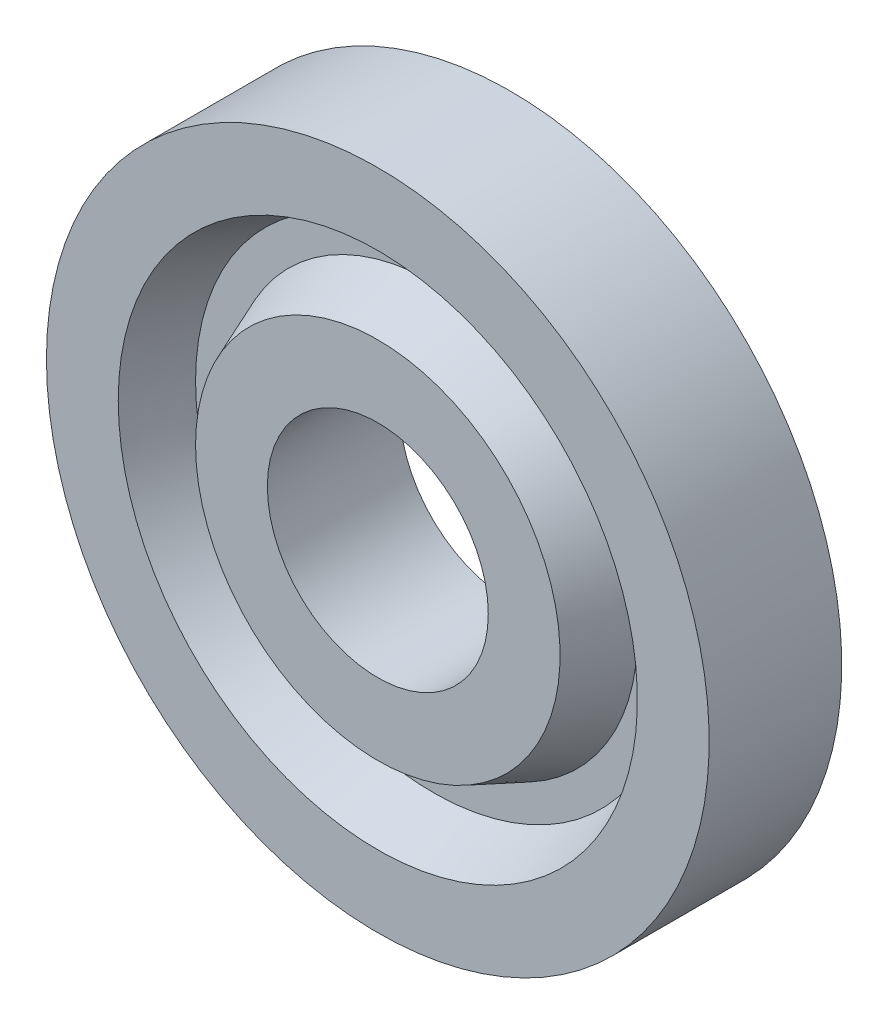
ISO-10303-21;
HEADER;
FILE_DESCRIPTION(('STEP AP214'),'2;1');
FILE_NAME('part.step','',(''),(''),'','','');
FILE_SCHEMA(('AUTOMOTIVE_DESIGN { 1 0 10303 214 1 1 1 1 }'));
ENDSEC;
DATA;
#1=APPLICATION_CONTEXT('core data for automotive mechanical design processes');
#2=APPLICATION_PROTOCOL_DEFINITION('international standard','automotive_design',2000,#1);
#3=PRODUCT_CONTEXT('',#1,'mechanical');
#4=PRODUCT('Part','Part','',(#3));
#5=PRODUCT_RELATED_PRODUCT_CATEGORY('part','',(#4));
#6=PRODUCT_DEFINITION_FORMATION('','',#4);
#7=PRODUCT_DEFINITION_CONTEXT('part definition',#1,'design');
#8=PRODUCT_DEFINITION('design','',#6,#7);
#9=PRODUCT_DEFINITION_SHAPE('','',#8);
#10=(LENGTH_UNIT() NAMED_UNIT(*) SI_UNIT(.MILLI.,.METRE.));
#11=(NAMED_UNIT(*) PLANE_ANGLE_UNIT() SI_UNIT($,.RADIAN.));
#12=(NAMED_UNIT(*) SI_UNIT($,.STERADIAN.) SOLID_ANGLE_UNIT());
#13=UNCERTAINTY_MEASURE_WITH_UNIT(LENGTH_MEASURE(1.E-05),#10,'distance_accuracy_value','');
#14=(GEOMETRIC_REPRESENTATION_CONTEXT(3) GLOBAL_UNCERTAINTY_ASSIGNED_CONTEXT((#13)) GLOBAL_UNIT_ASSIGNED_CONTEXT((#10,
#11,#12)) REPRESENTATION_CONTEXT('',''));
#15=CARTESIAN_POINT('',(0.,0.,0.));
#16=DIRECTION('',(0.,0.,1.));
#17=DIRECTION('',(1.,0.,0.));
#18=AXIS2_PLACEMENT_3D('',#15,#16,#17);
#19=CARTESIAN_POINT('',(5.,0.,-3.));
#20=DIRECTION('',(0.,0.,1.));
#21=DIRECTION('',(1.,0.,0.));
#22=AXIS2_PLACEMENT_3D('',#19,#20,#21);
#23=PLANE('',#22);
#24=CARTESIAN_POINT('',(0.,0.,-3.));
#25=DIRECTION('',(0.,0.,-1.));
#26=DIRECTION('',(-1.,0.,0.));
#27=AXIS2_PLACEMENT_3D('',#24,#25,#26);
#28=CIRCLE('',#27,5.);
#29=CARTESIAN_POINT('',(-4.99999999999999,0.,-3.));
#30=VERTEX_POINT('',#29);
#31=EDGE_CURVE('E71',#30,#30,#28,.T.);
#32=ORIENTED_EDGE('',*,*,#31,.F.);
#33=EDGE_LOOP('',(#32));
#34=FACE_BOUND('',#33,.T.);
#35=CARTESIAN_POINT('',(0.,0.,-3.));
#36=DIRECTION('',(0.,0.,-1.));
#37=DIRECTION('',(-1.,0.,0.));
#38=AXIS2_PLACEMENT_3D('',#35,#36,#37);
#39=CIRCLE('',#38,8.25);
#40=CARTESIAN_POINT('',(-8.24999999999999,0.,-3.));
#41=VERTEX_POINT('',#40);
#42=EDGE_CURVE('E10',#41,#41,#39,.T.);
#43=ORIENTED_EDGE('',*,*,#42,.T.);
#44=EDGE_LOOP('',(#43));
#45=FACE_BOUND('',#44,.T.);
#46=ADVANCED_FACE('F31',(#34,#45),#23,.F.);
#47=CARTESIAN_POINT('',(0.,0.,-0.5));
#48=DIRECTION('',(0.,0.,1.));
#49=DIRECTION('',(1.,0.,0.));
#50=AXIS2_PLACEMENT_3D('',#47,#48,#49);
#51=CONICAL_SURFACE('',#50,9.25,0.380506377112365);
#52=ORIENTED_EDGE('',*,*,#42,.F.);
#53=EDGE_LOOP('',(#52));
#54=FACE_BOUND('',#53,.T.);
#55=CARTESIAN_POINT('',(0.,0.,-0.5));
#56=DIRECTION('',(0.,0.,-1.));
#57=DIRECTION('',(-1.,0.,0.));
#58=AXIS2_PLACEMENT_3D('',#55,#56,#57);
#59=CIRCLE('',#58,9.25);
#60=CARTESIAN_POINT('',(-9.24999999999999,0.,-0.499999999999999));
#61=VERTEX_POINT('',#60);
#62=EDGE_CURVE('E37',#61,#61,#59,.T.);
#63=ORIENTED_EDGE('',*,*,#62,.T.);
#64=EDGE_LOOP('',(#63));
#65=FACE_BOUND('',#64,.T.);
#66=ADVANCED_FACE('F78',(#54,#65),#51,.T.);
#67=CARTESIAN_POINT('',(9.25,0.,-0.5));
#68=DIRECTION('',(0.,0.,1.));
#69=DIRECTION('',(1.,0.,0.));
#70=AXIS2_PLACEMENT_3D('',#67,#68,#69);
#71=PLANE('',#70);
#72=ORIENTED_EDGE('',*,*,#62,.F.);
#73=EDGE_LOOP('',(#72));
#74=FACE_BOUND('',#73,.T.);
#75=CARTESIAN_POINT('',(0.,0.,-0.5));
#76=DIRECTION('',(0.,0.,-1.));
#77=DIRECTION('',(-1.,0.,0.));
#78=AXIS2_PLACEMENT_3D('',#75,#76,#77);
#79=CIRCLE('',#78,10.75);
#80=CARTESIAN_POINT('',(-10.75,0.,-0.499999999999999));
#81=VERTEX_POINT('',#80);
#82=EDGE_CURVE('E41',#81,#81,#79,.T.);
#83=ORIENTED_EDGE('',*,*,#82,.T.);
#84=EDGE_LOOP('',(#83));
#85=FACE_BOUND('',#84,.T.);
#86=ADVANCED_FACE('F82',(#74,#85),#71,.F.);
#87=CARTESIAN_POINT('',(0.,0.,-3.));
#88=DIRECTION('',(0.,0.,-1.));
#89=DIRECTION('',(-1.,0.,0.));
#90=AXIS2_PLACEMENT_3D('',#87,#88,#89);
#91=CONICAL_SURFACE('',#90,11.75,0.380506377112365);
#92=ORIENTED_EDGE('',*,*,#82,.F.);
#93=EDGE_LOOP('',(#92));
#94=FACE_BOUND('',#93,.T.);
#95=CARTESIAN_POINT('',(0.,0.,-3.));
#96=DIRECTION('',(0.,0.,-1.));
#97=DIRECTION('',(-1.,0.,0.));
#98=AXIS2_PLACEMENT_3D('',#95,#96,#97);
#99=CIRCLE('',#98,11.75);
#100=CARTESIAN_POINT('',(-11.75,0.,-3.));
#101=VERTEX_POINT('',#100);
#102=EDGE_CURVE('E45',#101,#101,#99,.T.);
#103=ORIENTED_EDGE('',*,*,#102,.T.);
#104=EDGE_LOOP('',(#103));
#105=FACE_BOUND('',#104,.T.);
#106=ADVANCED_FACE('F87',(#94,#105),#91,.F.);
#107=CARTESIAN_POINT('',(11.75,0.,-3.));
#108=DIRECTION('',(0.,0.,1.));
#109=DIRECTION('',(1.,0.,0.));
#110=AXIS2_PLACEMENT_3D('',#107,#108,#109);
#111=PLANE('',#110);
#112=ORIENTED_EDGE('',*,*,#102,.F.);
#113=EDGE_LOOP('',(#112));
#114=FACE_BOUND('',#113,.T.);
#115=CARTESIAN_POINT('',(0.,0.,-3.));
#116=DIRECTION('',(0.,0.,-1.));
#117=DIRECTION('',(-1.,0.,0.));
#118=AXIS2_PLACEMENT_3D('',#115,#116,#117);
#119=CIRCLE('',#118,15.);
#120=CARTESIAN_POINT('',(-15.,0.,-2.99999999999999));
#121=VERTEX_POINT('',#120);
#122=EDGE_CURVE('E50',#121,#121,#119,.T.);
#123=ORIENTED_EDGE('',*,*,#122,.T.);
#124=EDGE_LOOP('',(#123));
#125=FACE_BOUND('',#124,.T.);
#126=ADVANCED_FACE('F93',(#114,#125),#111,.F.);
#127=CARTESIAN_POINT('',(0.,0.,-28.9111066531376));
#128=DIRECTION('',(0.,0.,-1.));
#129=DIRECTION('',(-1.,0.,0.));
#130=AXIS2_PLACEMENT_3D('',#127,#128,#129);
#131=CYLINDRICAL_SURFACE('',#130,15.);
#132=ORIENTED_EDGE('',*,*,#122,.F.);
#133=EDGE_LOOP('',(#132));
#134=FACE_BOUND('',#133,.T.);
#135=CARTESIAN_POINT('',(0.,0.,3.));
#136=DIRECTION('',(0.,0.,-1.));
#137=DIRECTION('',(-1.,0.,0.));
#138=AXIS2_PLACEMENT_3D('',#135,#136,#137);
#139=CIRCLE('',#138,15.);
#140=CARTESIAN_POINT('',(-15.,0.,3.));
#141=VERTEX_POINT('',#140);
#142=EDGE_CURVE('E53',#141,#141,#139,.T.);
#143=ORIENTED_EDGE('',*,*,#142,.T.);
#144=EDGE_LOOP('',(#143));
#145=FACE_BOUND('',#144,.T.);
#146=ADVANCED_FACE('F97',(#134,#145),#131,.T.);
#147=CARTESIAN_POINT('',(11.75,0.,3.));
#148=DIRECTION('',(0.,0.,-1.));
#149=DIRECTION('',(-1.,0.,0.));
#150=AXIS2_PLACEMENT_3D('',#147,#148,#149);
#151=PLANE('',#150);
#152=ORIENTED_EDGE('',*,*,#142,.F.);
#153=EDGE_LOOP('',(#152));
#154=FACE_BOUND('',#153,.T.);
#155=CARTESIAN_POINT('',(0.,0.,3.));
#156=DIRECTION('',(0.,0.,-1.));
#157=DIRECTION('',(-1.,0.,0.));
#158=AXIS2_PLACEMENT_3D('',#155,#156,#157);
#159=CIRCLE('',#158,11.75);
#160=CARTESIAN_POINT('',(-11.75,0.,3.));
#161=VERTEX_POINT('',#160);
#162=EDGE_CURVE('E56',#161,#161,#159,.T.);
#163=ORIENTED_EDGE('',*,*,#162,.T.);
#164=EDGE_LOOP('',(#163));
#165=FACE_BOUND('',#164,.T.);
#166=ADVANCED_FACE('F101',(#154,#165),#151,.F.);
#167=CARTESIAN_POINT('',(0.,0.,0.5));
#168=DIRECTION('',(0.,0.,1.));
#169=DIRECTION('',(1.,0.,0.));
#170=AXIS2_PLACEMENT_3D('',#167,#168,#169);
#171=CONICAL_SURFACE('',#170,10.75,0.380506377112364);
#172=ORIENTED_EDGE('',*,*,#162,.F.);
#173=EDGE_LOOP('',(#172));
#174=FACE_BOUND('',#173,.T.);
#175=CARTESIAN_POINT('',(0.,0.,0.5));
#176=DIRECTION('',(0.,0.,-1.));
#177=DIRECTION('',(-1.,0.,0.));
#178=AXIS2_PLACEMENT_3D('',#175,#176,#177);
#179=CIRCLE('',#178,10.75);
#180=CARTESIAN_POINT('',(-10.75,0.,0.500000000000002));
#181=VERTEX_POINT('',#180);
#182=EDGE_CURVE('E59',#181,#181,#179,.T.);
#183=ORIENTED_EDGE('',*,*,#182,.T.);
#184=EDGE_LOOP('',(#183));
#185=FACE_BOUND('',#184,.T.);
#186=ADVANCED_FACE('F105',(#174,#185),#171,.F.);
#187=CARTESIAN_POINT('',(10.75,0.,0.5));
#188=DIRECTION('',(0.,0.,-1.));
#189=DIRECTION('',(-1.,0.,0.));
#190=AXIS2_PLACEMENT_3D('',#187,#188,#189);
#191=PLANE('',#190);
#192=ORIENTED_EDGE('',*,*,#182,.F.);
#193=EDGE_LOOP('',(#192));
#194=FACE_BOUND('',#193,.T.);
#195=CARTESIAN_POINT('',(0.,0.,0.5));
#196=DIRECTION('',(0.,0.,-1.));
#197=DIRECTION('',(-1.,0.,0.));
#198=AXIS2_PLACEMENT_3D('',#195,#196,#197);
#199=CIRCLE('',#198,9.25);
#200=CARTESIAN_POINT('',(-9.24999999999999,0.,0.500000000000002));
#201=VERTEX_POINT('',#200);
#202=EDGE_CURVE('E62',#201,#201,#199,.T.);
#203=ORIENTED_EDGE('',*,*,#202,.T.);
#204=EDGE_LOOP('',(#203));
#205=FACE_BOUND('',#204,.T.);
#206=ADVANCED_FACE('F109',(#194,#205),#191,.F.);
#207=CARTESIAN_POINT('',(0.,0.,3.));
#208=DIRECTION('',(0.,0.,-1.));
#209=DIRECTION('',(-1.,0.,0.));
#210=AXIS2_PLACEMENT_3D('',#207,#208,#209);
#211=CONICAL_SURFACE('',#210,8.24999999999999,0.380506377112365);
#212=ORIENTED_EDGE('',*,*,#202,.F.);
#213=EDGE_LOOP('',(#212));
#214=FACE_BOUND('',#213,.T.);
#215=CARTESIAN_POINT('',(0.,0.,3.));
#216=DIRECTION('',(0.,0.,-1.));
#217=DIRECTION('',(-1.,0.,0.));
#218=AXIS2_PLACEMENT_3D('',#215,#216,#217);
#219=CIRCLE('',#218,8.24999999999999);
#220=CARTESIAN_POINT('',(-8.24999999999999,0.,3.));
#221=VERTEX_POINT('',#220);
#222=EDGE_CURVE('E65',#221,#221,#219,.T.);
#223=ORIENTED_EDGE('',*,*,#222,.T.);
#224=EDGE_LOOP('',(#223));
#225=FACE_BOUND('',#224,.T.);
#226=ADVANCED_FACE('F113',(#214,#225),#211,.T.);
#227=CARTESIAN_POINT('',(5.,0.,3.));
#228=DIRECTION('',(0.,0.,-1.));
#229=DIRECTION('',(-1.,0.,0.));
#230=AXIS2_PLACEMENT_3D('',#227,#228,#229);
#231=PLANE('',#230);
#232=ORIENTED_EDGE('',*,*,#222,.F.);
#233=EDGE_LOOP('',(#232));
#234=FACE_BOUND('',#233,.T.);
#235=CARTESIAN_POINT('',(0.,0.,3.));
#236=DIRECTION('',(0.,0.,-1.));
#237=DIRECTION('',(-1.,0.,0.));
#238=AXIS2_PLACEMENT_3D('',#235,#236,#237);
#239=CIRCLE('',#238,5.);
#240=CARTESIAN_POINT('',(-4.99999999999999,0.,3.));
#241=VERTEX_POINT('',#240);
#242=EDGE_CURVE('E68',#241,#241,#239,.T.);
#243=ORIENTED_EDGE('',*,*,#242,.T.);
#244=EDGE_LOOP('',(#243));
#245=FACE_BOUND('',#244,.T.);
#246=ADVANCED_FACE('F117',(#234,#245),#231,.F.);
#247=CARTESIAN_POINT('',(0.,0.,-28.9111066531376));
#248=DIRECTION('',(0.,0.,-1.));
#249=DIRECTION('',(-1.,0.,0.));
#250=AXIS2_PLACEMENT_3D('',#247,#248,#249);
#251=CYLINDRICAL_SURFACE('',#250,5.);
#252=ORIENTED_EDGE('',*,*,#242,.F.);
#253=EDGE_LOOP('',(#252));
#254=FACE_BOUND('',#253,.T.);
#255=ORIENTED_EDGE('',*,*,#31,.T.);
#256=EDGE_LOOP('',(#255));
#257=FACE_BOUND('',#256,.T.);
#258=ADVANCED_FACE('F75',(#254,#257),#251,.F.);
#259=CLOSED_SHELL('',(#46,#66,#86,#106,#126,#146,#166,#186,#206,#226,#246,#258));
#260=MANIFOLD_SOLID_BREP('B2',#259);
#261=ADVANCED_BREP_SHAPE_REPRESENTATION('',(#18,#260),#14);
#262=SHAPE_DEFINITION_REPRESENTATION(#9,#261);
ENDSEC;
END-ISO-10303-21;
